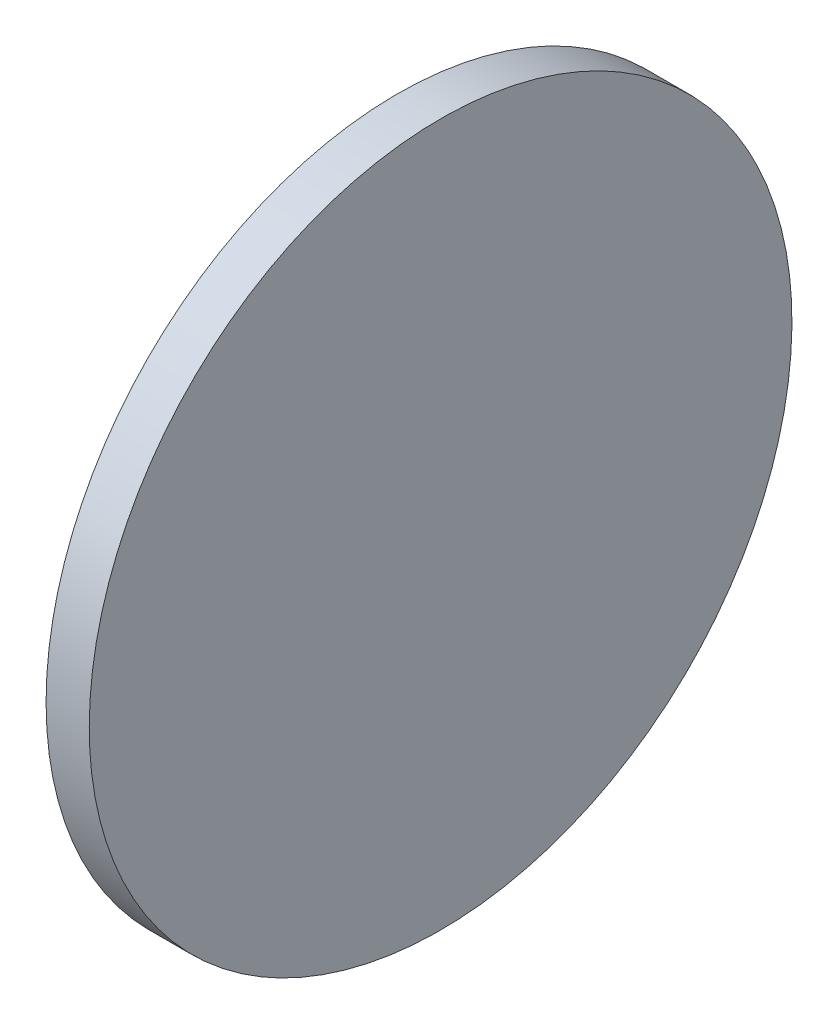
ISO-10303-21;
HEADER;
FILE_DESCRIPTION(('STEP AP214'),'2;1');
FILE_NAME('part.step','',(''),(''),'','','');
FILE_SCHEMA(('AUTOMOTIVE_DESIGN { 1 0 10303 214 1 1 1 1 }'));
ENDSEC;
DATA;
#1=APPLICATION_CONTEXT('core data for automotive mechanical design processes');
#2=APPLICATION_PROTOCOL_DEFINITION('international standard','automotive_design',2000,#1);
#3=PRODUCT_CONTEXT('',#1,'mechanical');
#4=PRODUCT('Part','Part','',(#3));
#5=PRODUCT_RELATED_PRODUCT_CATEGORY('part','',(#4));
#6=PRODUCT_DEFINITION_FORMATION('','',#4);
#7=PRODUCT_DEFINITION_CONTEXT('part definition',#1,'design');
#8=PRODUCT_DEFINITION('design','',#6,#7);
#9=PRODUCT_DEFINITION_SHAPE('','',#8);
#10=(LENGTH_UNIT() NAMED_UNIT(*) SI_UNIT(.MILLI.,.METRE.));
#11=(NAMED_UNIT(*) PLANE_ANGLE_UNIT() SI_UNIT($,.RADIAN.));
#12=(NAMED_UNIT(*) SI_UNIT($,.STERADIAN.) SOLID_ANGLE_UNIT());
#13=UNCERTAINTY_MEASURE_WITH_UNIT(LENGTH_MEASURE(1.E-05),#10,'distance_accuracy_value','');
#14=(GEOMETRIC_REPRESENTATION_CONTEXT(3) GLOBAL_UNCERTAINTY_ASSIGNED_CONTEXT((#13)) GLOBAL_UNIT_ASSIGNED_CONTEXT((#10,
#11,#12)) REPRESENTATION_CONTEXT('',''));
#15=CARTESIAN_POINT('',(0.,0.,0.));
#16=DIRECTION('',(0.,0.,1.));
#17=DIRECTION('',(1.,0.,0.));
#18=AXIS2_PLACEMENT_3D('',#15,#16,#17);
#19=CARTESIAN_POINT('',(-77.2375678722767,-9.28326390853357,-8.01565750597513));
#20=CARTESIAN_POINT('',(-77.2375678722767,-8.80421803646308,-8.01565750597513));
#21=CARTESIAN_POINT('',(-77.2375678722767,-7.8461262923221,-8.11002130640049));
#22=CARTESIAN_POINT('',(-77.2375678722767,-6.46421706874558,-8.52921888641883));
#23=CARTESIAN_POINT('',(-77.2375678722767,-5.19064223428243,-9.20995881790606));
#24=CARTESIAN_POINT('',(-77.2375678722767,-4.07434455559207,-10.1260806470585));
#25=CARTESIAN_POINT('',(-77.2375678722767,-3.15822272643963,-11.2423783257489));
#26=CARTESIAN_POINT('',(-77.2375678722767,-2.47748279495239,-12.515953160212));
#27=CARTESIAN_POINT('',(-77.2375678722767,-2.05828521493405,-13.8978623837885));
#28=CARTESIAN_POINT('',(-77.2375678722767,-1.91673951429602,-15.335));
#29=CARTESIAN_POINT('',(-77.2375678722767,-2.05828521493405,-16.7721376162115));
#30=CARTESIAN_POINT('',(-77.2375678722767,-2.47748279495239,-18.154046839788));
#31=CARTESIAN_POINT('',(-77.2375678722767,-3.15822272643963,-19.4276216742511));
#32=CARTESIAN_POINT('',(-77.2375678722767,-4.07434455559207,-20.5439193529415));
#33=CARTESIAN_POINT('',(-77.2375678722767,-5.19064223428243,-21.4600411820939));
#34=CARTESIAN_POINT('',(-77.2375678722767,-6.46421706874558,-22.1407811135812));
#35=CARTESIAN_POINT('',(-77.2375678722767,-7.8461262923221,-22.5599786935995));
#36=CARTESIAN_POINT('',(-77.2375678722767,-9.28326390853357,-22.7015243942376));
#37=CARTESIAN_POINT('',(-77.2375678722767,-10.720401524745,-22.5599786935995));
#38=CARTESIAN_POINT('',(-77.2375678722767,-12.1023107483216,-22.1407811135812));
#39=CARTESIAN_POINT('',(-77.2375678722767,-13.3758855827847,-21.4600411820939));
#40=CARTESIAN_POINT('',(-77.2375678722767,-14.4921832614751,-20.5439193529415));
#41=CARTESIAN_POINT('',(-77.2375678722767,-15.4083050906275,-19.4276216742511));
#42=CARTESIAN_POINT('',(-77.2375678722767,-16.0890450221147,-18.154046839788));
#43=CARTESIAN_POINT('',(-77.2375678722767,-16.5082426021331,-16.7721376162115));
#44=CARTESIAN_POINT('',(-77.2375678722767,-16.6497883027711,-15.335));
#45=CARTESIAN_POINT('',(-77.2375678722767,-16.5082426021331,-13.8978623837885));
#46=CARTESIAN_POINT('',(-77.2375678722767,-16.0890450221147,-12.515953160212));
#47=CARTESIAN_POINT('',(-77.2375678722767,-15.4083050906275,-11.2423783257489));
#48=CARTESIAN_POINT('',(-77.2375678722767,-14.4921832614751,-10.1260806470585));
#49=CARTESIAN_POINT('',(-77.2375678722767,-13.3758855827847,-9.20995881790606));
#50=CARTESIAN_POINT('',(-77.2375678722767,-12.1023107483216,-8.52921888641882));
#51=CARTESIAN_POINT('',(-77.2375678722767,-10.720401524745,-8.11002130640049));
#52=CARTESIAN_POINT('',(-77.2375678722767,-9.76230978060406,-8.01565750597513));
#53=CARTESIAN_POINT('',(-77.2375678722767,-9.28326390853357,-8.01565750597513));
#54=B_SPLINE_CURVE_WITH_KNOTS('',3,(#19,#20,#21,#22,#23,#24,#25,#26,#27,#28,#29,#30,#31,#32,#33,
#34,#35,#36,#37,#38,#39,#40,#41,#42,#43,#44,#45,#46,#47,#48,#49,#50,#51,#52,#53),.UNSPECIFIED.,
.T.,.F.,(4,1,1,1,1,1,1,1,1,1,1,1,1,1,1,1,1,1,1,1,1,1,1,1,1,1,1,1,1,1,1,1,4),(0.,0.03125,0.0625,
0.09375,0.125,0.15625,0.1875,0.21875,0.25,0.28125,0.3125,0.34375,0.375,0.40625,0.4375,0.46875,
0.5,0.53125,0.5625,0.59375,0.625,0.65625,0.6875,0.71875,0.75,0.78125,0.8125,0.84375,0.875,
0.90625,0.9375,0.96875,1.),.UNSPECIFIED.);
#55=DIRECTION('',(-1.,0.,0.));
#56=VECTOR('',#55,1.);
#57=SURFACE_OF_LINEAR_EXTRUSION('',#54,#56);
#58=CARTESIAN_POINT('',(-77.2375678722767,-9.28326390853357,-8.01565750597513));
#59=CARTESIAN_POINT('',(-77.2375678722767,-8.80421803646308,-8.01565750597513));
#60=CARTESIAN_POINT('',(-77.2375678722767,-7.8461262923221,-8.11002130640049));
#61=CARTESIAN_POINT('',(-77.2375678722767,-6.46421706874558,-8.52921888641883));
#62=CARTESIAN_POINT('',(-77.2375678722767,-5.19064223428243,-9.20995881790606));
#63=CARTESIAN_POINT('',(-77.2375678722767,-4.07434455559207,-10.1260806470585));
#64=CARTESIAN_POINT('',(-77.2375678722767,-3.15822272643963,-11.2423783257489));
#65=CARTESIAN_POINT('',(-77.2375678722767,-2.47748279495239,-12.515953160212));
#66=CARTESIAN_POINT('',(-77.2375678722767,-2.05828521493405,-13.8978623837885));
#67=CARTESIAN_POINT('',(-77.2375678722767,-1.91673951429602,-15.335));
#68=CARTESIAN_POINT('',(-77.2375678722767,-2.05828521493405,-16.7721376162115));
#69=CARTESIAN_POINT('',(-77.2375678722767,-2.47748279495239,-18.154046839788));
#70=CARTESIAN_POINT('',(-77.2375678722767,-3.15822272643963,-19.4276216742511));
#71=CARTESIAN_POINT('',(-77.2375678722767,-4.07434455559207,-20.5439193529415));
#72=CARTESIAN_POINT('',(-77.2375678722767,-5.19064223428243,-21.4600411820939));
#73=CARTESIAN_POINT('',(-77.2375678722767,-6.46421706874558,-22.1407811135812));
#74=CARTESIAN_POINT('',(-77.2375678722767,-7.8461262923221,-22.5599786935995));
#75=CARTESIAN_POINT('',(-77.2375678722767,-9.28326390853357,-22.7015243942376));
#76=CARTESIAN_POINT('',(-77.2375678722767,-10.720401524745,-22.5599786935995));
#77=CARTESIAN_POINT('',(-77.2375678722767,-12.1023107483216,-22.1407811135812));
#78=CARTESIAN_POINT('',(-77.2375678722767,-13.3758855827847,-21.4600411820939));
#79=CARTESIAN_POINT('',(-77.2375678722767,-14.4921832614751,-20.5439193529415));
#80=CARTESIAN_POINT('',(-77.2375678722767,-15.4083050906275,-19.4276216742511));
#81=CARTESIAN_POINT('',(-77.2375678722767,-16.0890450221147,-18.154046839788));
#82=CARTESIAN_POINT('',(-77.2375678722767,-16.5082426021331,-16.7721376162115));
#83=CARTESIAN_POINT('',(-77.2375678722767,-16.6497883027711,-15.335));
#84=CARTESIAN_POINT('',(-77.2375678722767,-16.5082426021331,-13.8978623837885));
#85=CARTESIAN_POINT('',(-77.2375678722767,-16.0890450221147,-12.515953160212));
#86=CARTESIAN_POINT('',(-77.2375678722767,-15.4083050906275,-11.2423783257489));
#87=CARTESIAN_POINT('',(-77.2375678722767,-14.4921832614751,-10.1260806470585));
#88=CARTESIAN_POINT('',(-77.2375678722767,-13.3758855827847,-9.20995881790606));
#89=CARTESIAN_POINT('',(-77.2375678722767,-12.1023107483216,-8.52921888641882));
#90=CARTESIAN_POINT('',(-77.2375678722767,-10.720401524745,-8.11002130640049));
#91=CARTESIAN_POINT('',(-77.2375678722767,-9.76230978060406,-8.01565750597513));
#92=CARTESIAN_POINT('',(-77.2375678722767,-9.28326390853357,-8.01565750597513));
#93=B_SPLINE_CURVE_WITH_KNOTS('',3,(#58,#59,#60,#61,#62,#63,#64,#65,#66,#67,#68,#69,#70,#71,#72,
#73,#74,#75,#76,#77,#78,#79,#80,#81,#82,#83,#84,#85,#86,#87,#88,#89,#90,#91,#92),.UNSPECIFIED.,
.T.,.F.,(4,1,1,1,1,1,1,1,1,1,1,1,1,1,1,1,1,1,1,1,1,1,1,1,1,1,1,1,1,1,1,1,4),(0.,0.03125,0.0625,
0.09375,0.125,0.15625,0.1875,0.21875,0.25,0.28125,0.3125,0.34375,0.375,0.40625,0.4375,0.46875,
0.5,0.53125,0.5625,0.59375,0.625,0.65625,0.6875,0.71875,0.75,0.78125,0.8125,0.84375,0.875,
0.90625,0.9375,0.96875,1.),.UNSPECIFIED.);
#94=CARTESIAN_POINT('',(-77.2375678722767,-9.28326390853357,-8.01565750597513));
#95=VERTEX_POINT('',#94);
#96=EDGE_CURVE('E10',#95,#95,#93,.T.);
#97=ORIENTED_EDGE('',*,*,#96,.T.);
#98=EDGE_LOOP('',(#97));
#99=FACE_BOUND('',#98,.T.);
#100=CARTESIAN_POINT('',(-78.1368546740449,-9.28326390853357,-8.01565750597513));
#101=CARTESIAN_POINT('',(-78.1368546740449,-9.40302611192993,-8.01565753081639));
#102=CARTESIAN_POINT('',(-78.1368546740449,-9.52278744371222,-8.01860640995524));
#103=CARTESIAN_POINT('',(-78.1368546740449,-9.76202246275414,-8.03037352943423));
#104=CARTESIAN_POINT('',(-78.1368546740449,-9.88149614777216,-8.03919181536673));
#105=CARTESIAN_POINT('',(-78.1368546740449,-10.11986810248,-8.0626694001569));
#106=CARTESIAN_POINT('',(-78.1368546740449,-10.2387663721698,-8.07732869901456));
#107=CARTESIAN_POINT('',(-78.1368546740449,-10.4757004562651,-8.11246015693882));
#108=CARTESIAN_POINT('',(-78.1368546740449,-10.5937362773629,-8.13293227085123));
#109=CARTESIAN_POINT('',(-78.1368546740449,-10.8286573079155,-8.17966096840985));
#110=CARTESIAN_POINT('',(-78.1368546740449,-10.9455425173703,-8.20591755205606));
#111=CARTESIAN_POINT('',(-78.1368546740449,-11.1778853119867,-8.26413107213635));
#112=CARTESIAN_POINT('',(-78.1368546740449,-11.2933428860515,-8.29608805284855));
#113=CARTESIAN_POINT('',(-78.1368546740449,-11.5225542711089,-8.36561856625616));
#114=CARTESIAN_POINT('',(-78.1368546740449,-11.6363080821015,-8.40319209895157));
#115=CARTESIAN_POINT('',(-78.1368546740449,-11.8618357554725,-8.48387206723541));
#116=CARTESIAN_POINT('',(-78.1368546740449,-11.973609633224,-8.52697845984292));
#117=CARTESIAN_POINT('',(-78.1368546740449,-12.1949004003814,-8.6186400968177));
#118=CARTESIAN_POINT('',(-78.1368546740449,-12.3044172897873,-8.66719534118496));
#119=CARTESIAN_POINT('',(-78.1368546740449,-12.5209387897195,-8.76961813575815));
#120=CARTESIAN_POINT('',(-78.1368546740449,-12.627943380724,-8.82348572722654));
#121=CARTESIAN_POINT('',(-78.1368546740449,-12.8391858026787,-8.93639715414561));
#122=CARTESIAN_POINT('',(-78.1368546740449,-12.9434236336289,-8.9954409895963));
#123=CARTESIAN_POINT('',(-78.1368546740449,-13.1488779750984,-9.11856898135826));
#124=CARTESIAN_POINT('',(-78.1368546740449,-13.2500945090806,-9.18265309851363));
#125=CARTESIAN_POINT('',(-78.1368546740449,-13.4492509378979,-9.31572516985358));
#126=CARTESIAN_POINT('',(-78.1368546740449,-13.5471908327331,-9.38471312403816));
#127=CARTESIAN_POINT('',(-78.1368546740449,-13.7395702367892,-9.52740914248023));
#128=CARTESIAN_POINT('',(-78.1368546740449,-13.8340097188137,-9.60111724339884));
#129=CARTESIAN_POINT('',(-78.1368546740449,-14.0191652502248,-9.75307046103254));
#130=CARTESIAN_POINT('',(-78.1368546740449,-14.1098812996114,-9.83131557774763));
#131=CARTESIAN_POINT('',(-78.1368546740449,-14.2873668139582,-9.9921598533104));
#132=CARTESIAN_POINT('',(-78.1368546740449,-14.3741363095692,-10.0747589783319));
#133=CARTESIAN_POINT('',(-78.1368546740449,-14.5435049302017,-10.2441275989644));
#134=CARTESIAN_POINT('',(-78.1368546740449,-14.6261040552232,-10.3308970945754));
#135=CARTESIAN_POINT('',(-78.1368546740449,-14.786948330786,-10.5083826089222));
#136=CARTESIAN_POINT('',(-78.1368546740449,-14.8651934475011,-10.5990986583088));
#137=CARTESIAN_POINT('',(-78.1368546740449,-15.0171466651347,-10.7842541897199));
#138=CARTESIAN_POINT('',(-78.1368546740449,-15.0908547660534,-10.8786936717443));
#139=CARTESIAN_POINT('',(-78.1368546740449,-15.2335507844954,-11.0710730758005));
#140=CARTESIAN_POINT('',(-78.1368546740449,-15.30253873868,-11.1690129706357));
#141=CARTESIAN_POINT('',(-78.1368546740449,-15.43561081002,-11.3681693994529));
#142=CARTESIAN_POINT('',(-78.1368546740449,-15.4996949271753,-11.4693859334349));
#143=CARTESIAN_POINT('',(-78.1368546740449,-15.6228229189373,-11.674840274905));
#144=CARTESIAN_POINT('',(-78.1368546740449,-15.681866754388,-11.7790781058559));
#145=CARTESIAN_POINT('',(-78.1368546740449,-15.794778181307,-11.9903205278086));
#146=CARTESIAN_POINT('',(-78.1368546740449,-15.8486457727753,-12.0973251188105));
#147=CARTESIAN_POINT('',(-78.1368546740449,-15.9510685673488,-12.3138466187499));
#148=CARTESIAN_POINT('',(-78.1368546740449,-15.9996238117165,-12.4233635081656));
#149=CARTESIAN_POINT('',(-78.1368546740449,-16.09128544869,-12.6446542752962));
#150=CARTESIAN_POINT('',(-78.1368546740449,-16.1343918412957,-12.7564281530112));
#151=CARTESIAN_POINT('',(-78.1368546740449,-16.2150718095845,-12.981955826482));
#152=CARTESIAN_POINT('',(-78.1368546740449,-16.2526453422866,-13.0957096376109));
#153=CARTESIAN_POINT('',(-78.1368546740449,-16.3221758556758,-13.3249210222958));
#154=CARTESIAN_POINT('',(-78.1368546740449,-16.3541328363629,-13.4403785958519));
#155=CARTESIAN_POINT('',(-78.1368546740449,-16.4123463565118,-13.6727213918583));
#156=CARTESIAN_POINT('',(-78.1368546740449,-16.4386029402518,-13.7896066032121));
#157=CARTESIAN_POINT('',(-78.1368546740449,-16.4853316375543,-14.0245276285766));
#158=CARTESIAN_POINT('',(-78.1368546740449,-16.5058037511169,-14.1425634425874));
#159=CARTESIAN_POINT('',(-78.1368546740449,-16.5409352099969,-14.3794975460449));
#160=CARTESIAN_POINT('',(-78.1368546740449,-16.5555945101602,-14.4983958421841));
#161=CARTESIAN_POINT('',(-78.1368546740449,-16.5790720913833,-14.736767724631));
#162=CARTESIAN_POINT('',(-78.1368546740449,-16.5878903724431,-14.8562413109387));
#163=CARTESIAN_POINT('',(-78.1368546740449,-16.5996575052346,-15.0954765996611));
#164=CARTESIAN_POINT('',(-78.1368546740449,-16.6026064025584,-15.2152382998306));
#165=CARTESIAN_POINT('',(-78.1368546740449,-16.6026064025584,-15.4547617001695));
#166=CARTESIAN_POINT('',(-78.1368546740449,-16.5996575052346,-15.5745234003389));
#167=CARTESIAN_POINT('',(-78.1368546740449,-16.5878903724431,-15.8137586890614));
#168=CARTESIAN_POINT('',(-78.1368546740449,-16.5790720913833,-15.9332322753691));
#169=CARTESIAN_POINT('',(-78.1368546740449,-16.5555945101602,-16.171604157816));
#170=CARTESIAN_POINT('',(-78.1368546740449,-16.5409352099969,-16.2905024539551));
#171=CARTESIAN_POINT('',(-78.1368546740449,-16.5058037511169,-16.5274365574126));
#172=CARTESIAN_POINT('',(-78.1368546740449,-16.4853316375543,-16.6454723714234));
#173=CARTESIAN_POINT('',(-78.1368546740449,-16.4386029402518,-16.8803933967879));
#174=CARTESIAN_POINT('',(-78.1368546740449,-16.4123463565118,-16.9972786081417));
#175=CARTESIAN_POINT('',(-78.1368546740449,-16.3541328363629,-17.2296214041482));
#176=CARTESIAN_POINT('',(-78.1368546740449,-16.3221758556758,-17.3450789777042));
#177=CARTESIAN_POINT('',(-78.1368546740449,-16.2526453422866,-17.5742903623891));
#178=CARTESIAN_POINT('',(-78.1368546740449,-16.2150718095845,-17.6880441735181));
#179=CARTESIAN_POINT('',(-78.1368546740449,-16.1343918412957,-17.9135718469889));
#180=CARTESIAN_POINT('',(-78.1368546740449,-16.09128544869,-18.0253457247038));
#181=CARTESIAN_POINT('',(-78.1368546740449,-15.9996238117165,-18.2466364918344));
#182=CARTESIAN_POINT('',(-78.1368546740449,-15.9510685673488,-18.3561533812502));
#183=CARTESIAN_POINT('',(-78.1368546740449,-15.8486457727752,-18.5726748811895));
#184=CARTESIAN_POINT('',(-78.1368546740449,-15.794778181307,-18.6796794721914));
#185=CARTESIAN_POINT('',(-78.1368546740449,-15.681866754388,-18.8909218941442));
#186=CARTESIAN_POINT('',(-78.1368546740449,-15.6228229189373,-18.9951597250951));
#187=CARTESIAN_POINT('',(-78.1368546740449,-15.4996949271753,-19.2006140665651));
#188=CARTESIAN_POINT('',(-78.1368546740449,-15.4356108100199,-19.3018306005471));
#189=CARTESIAN_POINT('',(-78.1368546740449,-15.30253873868,-19.5009870293643));
#190=CARTESIAN_POINT('',(-78.1368546740449,-15.2335507844954,-19.5989269241995));
#191=CARTESIAN_POINT('',(-78.1368546740449,-15.0908547660533,-19.7913063282557));
#192=CARTESIAN_POINT('',(-78.1368546740449,-15.0171466651347,-19.8857458102801));
#193=CARTESIAN_POINT('',(-78.1368546740449,-14.865193447501,-20.0709013416912));
#194=CARTESIAN_POINT('',(-78.1368546740449,-14.7869483307859,-20.1616173910779));
#195=CARTESIAN_POINT('',(-78.1368546740449,-14.6261040552232,-20.3391029054246));
#196=CARTESIAN_POINT('',(-78.1368546740449,-14.5435049302017,-20.4258724010356));
#197=CARTESIAN_POINT('',(-78.1368546740449,-14.3741363095691,-20.5952410216681));
#198=CARTESIAN_POINT('',(-78.1368546740449,-14.2873668139581,-20.6778401466896));
#199=CARTESIAN_POINT('',(-78.1368546740449,-14.1098812996114,-20.8386844222524));
#200=CARTESIAN_POINT('',(-78.1368546740449,-14.0191652502248,-20.9169295389675));
#201=CARTESIAN_POINT('',(-78.1368546740449,-13.8340097188137,-21.0688827566012));
#202=CARTESIAN_POINT('',(-78.1368546740449,-13.7395702367892,-21.1425908575198));
#203=CARTESIAN_POINT('',(-78.1368546740449,-13.547190832733,-21.2852868759619));
#204=CARTESIAN_POINT('',(-78.1368546740449,-13.4492509378978,-21.3542748301464));
#205=CARTESIAN_POINT('',(-78.1368546740449,-13.2500945090806,-21.4873469014864));
#206=CARTESIAN_POINT('',(-78.1368546740449,-13.1488779750987,-21.5514310186418));
#207=CARTESIAN_POINT('',(-78.1368546740449,-12.9434236336286,-21.6745590104037));
#208=CARTESIAN_POINT('',(-78.1368546740449,-12.8391858026777,-21.7336028458545));
#209=CARTESIAN_POINT('',(-78.1368546740449,-12.6279433807249,-21.8465142727734));
#210=CARTESIAN_POINT('',(-78.1368546740449,-12.520938789723,-21.9003818642417));
#211=CARTESIAN_POINT('',(-78.1368546740449,-12.3044172897837,-22.0028046588152));
#212=CARTESIAN_POINT('',(-78.1368546740449,-12.194900400368,-22.051359903183));
#213=CARTESIAN_POINT('',(-78.1368546740449,-11.9736096332373,-22.1430215401564));
#214=CARTESIAN_POINT('',(-78.1368546740449,-11.8618357555224,-22.1861279327621));
#215=CARTESIAN_POINT('',(-78.1368546740449,-11.6363080820516,-22.2668079010509));
#216=CARTESIAN_POINT('',(-78.1368546740449,-11.5225542709227,-22.3043814337531));
#217=CARTESIAN_POINT('',(-78.1368546740449,-11.2933428862377,-22.3739119471423));
#218=CARTESIAN_POINT('',(-78.1368546740449,-11.1778853126817,-22.4058689278293));
#219=CARTESIAN_POINT('',(-78.1368546740449,-10.9455425166752,-22.4640824479783));
#220=CARTESIAN_POINT('',(-78.1368546740449,-10.8286573053215,-22.4903390317182));
#221=CARTESIAN_POINT('',(-78.1368546740449,-10.5937362799569,-22.5370677290207));
#222=CARTESIAN_POINT('',(-78.1368546740449,-10.4757004659461,-22.5575398425833));
#223=CARTESIAN_POINT('',(-78.1368546740449,-10.2387663624887,-22.5926713014633));
#224=CARTESIAN_POINT('',(-78.1368546740449,-10.1198680663495,-22.6073306016267));
#225=CARTESIAN_POINT('',(-78.1368546740449,-9.88149618390262,-22.6308081828497));
#226=CARTESIAN_POINT('',(-78.1368546740449,-9.76202259759491,-22.6396264639095));
#227=CARTESIAN_POINT('',(-78.1368546740449,-9.52278730887248,-22.651393596701));
#228=CARTESIAN_POINT('',(-78.1368546740449,-9.40302560870302,-22.6543424940249));
#229=CARTESIAN_POINT('',(-78.1368546740449,-9.16350220836409,-22.6543424940249));
#230=CARTESIAN_POINT('',(-78.1368546740449,-9.04374050819463,-22.651393596701));
#231=CARTESIAN_POINT('',(-78.1368546740449,-8.80450521947221,-22.6396264639095));
#232=CARTESIAN_POINT('',(-78.1368546740449,-8.68503163316449,-22.6308081828497));
#233=CARTESIAN_POINT('',(-78.1368546740449,-8.44665975071761,-22.6073306016267));
#234=CARTESIAN_POINT('',(-78.1368546740449,-8.32776145457844,-22.5926713014633));
#235=CARTESIAN_POINT('',(-78.1368546740449,-8.09082735112097,-22.5575398425833));
#236=CARTESIAN_POINT('',(-78.1368546740449,-7.97279153711019,-22.5370677290207));
#237=CARTESIAN_POINT('',(-78.1368546740449,-7.73787051174564,-22.4903390317182));
#238=CARTESIAN_POINT('',(-78.1368546740449,-7.62098530039187,-22.4640824479783));
#239=CARTESIAN_POINT('',(-78.1368546740449,-7.3886425043854,-22.4058689278293));
#240=CARTESIAN_POINT('',(-78.1368546740449,-7.27318493082939,-22.3739119471423));
#241=CARTESIAN_POINT('',(-78.1368546740449,-7.04397354614445,-22.304381433753));
#242=CARTESIAN_POINT('',(-78.1368546740449,-6.93021973501552,-22.2668079010509));
#243=CARTESIAN_POINT('',(-78.1368546740449,-6.7046920615447,-22.1861279327621));
#244=CARTESIAN_POINT('',(-78.1368546740449,-6.59291818382978,-22.1430215401564));
#245=CARTESIAN_POINT('',(-78.1368546740449,-6.37162741669914,-22.051359903183));
#246=CARTESIAN_POINT('',(-78.1368546740449,-6.26211052728342,-22.0028046588152));
#247=CARTESIAN_POINT('',(-78.1368546740449,-6.04558902734409,-21.9003818642417));
#248=CARTESIAN_POINT('',(-78.1368546740449,-5.93858443634218,-21.8465142727734));
#249=CARTESIAN_POINT('',(-78.1368546740449,-5.7273420143894,-21.7336028458544));
#250=CARTESIAN_POINT('',(-78.1368546740449,-5.62310418343852,-21.6745590104037));
#251=CARTESIAN_POINT('',(-78.1368546740449,-5.41764984196846,-21.5514310186417));
#252=CARTESIAN_POINT('',(-78.1368546740449,-5.31643330798648,-21.4873469014864));
#253=CARTESIAN_POINT('',(-78.1368546740449,-5.11727687916929,-21.3542748301464));
#254=CARTESIAN_POINT('',(-78.1368546740449,-5.01933698433407,-21.2852868759618));
#255=CARTESIAN_POINT('',(-78.1368546740449,-4.82695758027789,-21.1425908575198));
#256=CARTESIAN_POINT('',(-78.1368546740449,-4.73251809825343,-21.0688827566012));
#257=CARTESIAN_POINT('',(-78.1368546740449,-4.54736256684234,-20.9169295389675));
#258=CARTESIAN_POINT('',(-78.1368546740449,-4.4566465174557,-20.8386844222524));
#259=CARTESIAN_POINT('',(-78.1368546740449,-4.27916100310897,-20.6778401466896));
#260=CARTESIAN_POINT('',(-78.1368546740449,-4.19239150749797,-20.5952410216681));
#261=CARTESIAN_POINT('',(-78.1368546740449,-4.02302288686546,-20.4258724010356));
#262=CARTESIAN_POINT('',(-78.1368546740449,-3.94042376184395,-20.3391029054246));
#263=CARTESIAN_POINT('',(-78.1368546740449,-3.77957948628118,-20.1616173910779));
#264=CARTESIAN_POINT('',(-78.1368546740449,-3.70133436956609,-20.0709013416912));
#265=CARTESIAN_POINT('',(-78.1368546740449,-3.5493811519324,-19.8857458102801));
#266=CARTESIAN_POINT('',(-78.1368546740449,-3.47567305101379,-19.7913063282557));
#267=CARTESIAN_POINT('',(-78.1368546740449,-3.33297703257172,-19.5989269241995));
#268=CARTESIAN_POINT('',(-78.1368546740449,-3.26398907838713,-19.5009870293643));
#269=CARTESIAN_POINT('',(-78.1368546740449,-3.13091700704719,-19.3018306005471));
#270=CARTESIAN_POINT('',(-78.1368546740449,-3.06683288989183,-19.2006140665651));
#271=CARTESIAN_POINT('',(-78.1368546740449,-2.94370489812984,-18.995159725095));
#272=CARTESIAN_POINT('',(-78.1368546740449,-2.88466106267912,-18.8909218941442));
#273=CARTESIAN_POINT('',(-78.1368546740449,-2.77174963576014,-18.6796794721914));
#274=CARTESIAN_POINT('',(-78.1368546740449,-2.71788204429188,-18.5726748811895));
#275=CARTESIAN_POINT('',(-78.1368546740449,-2.61545924971835,-18.3561533812501));
#276=CARTESIAN_POINT('',(-78.1368546740449,-2.5669040053506,-18.2466364918344));
#277=CARTESIAN_POINT('',(-78.1368546740449,-2.47524236837714,-18.0253457247038));
#278=CARTESIAN_POINT('',(-78.1368546740449,-2.43213597577143,-17.9135718469889));
#279=CARTESIAN_POINT('',(-78.1368546740449,-2.35145600748267,-17.688044173518));
#280=CARTESIAN_POINT('',(-78.1368546740449,-2.31388247478052,-17.5742903623891));
#281=CARTESIAN_POINT('',(-78.1368546740449,-2.2443519613913,-17.3450789777042));
#282=CARTESIAN_POINT('',(-78.1368546740449,-2.21239498070422,-17.2296214041482));
#283=CARTESIAN_POINT('',(-78.1368546740449,-2.15418146055531,-16.9972786081417));
#284=CARTESIAN_POINT('',(-78.1368546740449,-2.12792487681536,-16.8803933967879));
#285=CARTESIAN_POINT('',(-78.1368546740449,-2.08119617951284,-16.6454723714234));
#286=CARTESIAN_POINT('',(-78.1368546740449,-2.06072406595027,-16.5274365574126));
#287=CARTESIAN_POINT('',(-78.1368546740449,-2.02559260707023,-16.2905024539551));
#288=CARTESIAN_POINT('',(-78.1368546740449,-2.01093330690692,-16.1716041578159));
#289=CARTESIAN_POINT('',(-78.1368546740449,-1.98745572568383,-15.9332322753691));
#290=CARTESIAN_POINT('',(-78.1368546740449,-1.97863744462406,-15.8137586890613));
#291=CARTESIAN_POINT('',(-78.1368546740449,-1.96687031183258,-15.5745234003389));
#292=CARTESIAN_POINT('',(-78.1368546740449,-1.9639214145087,-15.4547617001695));
#293=CARTESIAN_POINT('',(-78.1368546740449,-1.9639214145087,-15.2152382998305));
#294=CARTESIAN_POINT('',(-78.1368546740449,-1.96687031183258,-15.0954765996611));
#295=CARTESIAN_POINT('',(-78.1368546740449,-1.97863744462406,-14.8562413109387));
#296=CARTESIAN_POINT('',(-78.1368546740449,-1.98745572568383,-14.7367677246309));
#297=CARTESIAN_POINT('',(-78.1368546740449,-2.01093330690692,-14.4983958421841));
#298=CARTESIAN_POINT('',(-78.1368546740449,-2.02559260707023,-14.3794975460449));
#299=CARTESIAN_POINT('',(-78.1368546740449,-2.06072406595027,-14.1425634425874));
#300=CARTESIAN_POINT('',(-78.1368546740449,-2.08119617951284,-14.0245276285766));
#301=CARTESIAN_POINT('',(-78.1368546740449,-2.12792487681536,-13.7896066032121));
#302=CARTESIAN_POINT('',(-78.1368546740449,-2.15418146055531,-13.6727213918583));
#303=CARTESIAN_POINT('',(-78.1368546740449,-2.21239498070422,-13.4403785958518));
#304=CARTESIAN_POINT('',(-78.1368546740449,-2.2443519613913,-13.3249210222958));
#305=CARTESIAN_POINT('',(-78.1368546740449,-2.31388247478053,-13.0957096376109));
#306=CARTESIAN_POINT('',(-78.1368546740449,-2.35145600748267,-12.981955826482));
#307=CARTESIAN_POINT('',(-78.1368546740449,-2.43213597577143,-12.7564281530111));
#308=CARTESIAN_POINT('',(-78.1368546740449,-2.47524236837715,-12.6446542752962));
#309=CARTESIAN_POINT('',(-78.1368546740449,-2.5669040053506,-12.4233635081656));
#310=CARTESIAN_POINT('',(-78.1368546740449,-2.61545924971835,-12.3138466187499));
#311=CARTESIAN_POINT('',(-78.136854674045,-2.71788204429189,-12.0973251188105));
#312=CARTESIAN_POINT('',(-78.136854674045,-2.77174963576015,-11.9903205278086));
#313=CARTESIAN_POINT('',(-78.1368546740449,-2.88466106267913,-11.7790781058558));
#314=CARTESIAN_POINT('',(-78.1368546740449,-2.94370489812985,-11.674840274905));
#315=CARTESIAN_POINT('',(-78.1368546740449,-3.06683288989183,-11.4693859334349));
#316=CARTESIAN_POINT('',(-78.1368546740449,-3.13091700704719,-11.3681693994529));
#317=CARTESIAN_POINT('',(-78.1368546740449,-3.26398907838714,-11.1690129706357));
#318=CARTESIAN_POINT('',(-78.1368546740449,-3.33297703257172,-11.0710730758005));
#319=CARTESIAN_POINT('',(-78.1368546740449,-3.47567305101379,-10.8786936717443));
#320=CARTESIAN_POINT('',(-78.1368546740449,-3.5493811519324,-10.7842541897199));
#321=CARTESIAN_POINT('',(-78.1368546740449,-3.7013343695661,-10.5990986583088));
#322=CARTESIAN_POINT('',(-78.1368546740449,-3.77957948628118,-10.5083826089221));
#323=CARTESIAN_POINT('',(-78.1368546740449,-3.94042376184395,-10.3308970945754));
#324=CARTESIAN_POINT('',(-78.1368546740449,-4.02302288686547,-10.2441275989644));
#325=CARTESIAN_POINT('',(-78.1368546740449,-4.19239150749798,-10.0747589783319));
#326=CARTESIAN_POINT('',(-78.1368546740449,-4.27916100310898,-9.99215985331039));
#327=CARTESIAN_POINT('',(-78.1368546740449,-4.45664651745571,-9.83131557774762));
#328=CARTESIAN_POINT('',(-78.1368546740449,-4.54736256684234,-9.75307046103253));
#329=CARTESIAN_POINT('',(-78.1368546740449,-4.73251809825344,-9.60111724339884));
#330=CARTESIAN_POINT('',(-78.1368546740449,-4.82695758027792,-9.52740914248023));
#331=CARTESIAN_POINT('',(-78.1368546740449,-5.01933698433406,-9.38471312403816));
#332=CARTESIAN_POINT('',(-78.1368546740449,-5.11727687916923,-9.31572516985357));
#333=CARTESIAN_POINT('',(-78.1368546740449,-5.31643330798656,-9.18265309851362));
#334=CARTESIAN_POINT('',(-78.1368546740449,-5.41764984196873,-9.11856898135825));
#335=CARTESIAN_POINT('',(-78.1368546740449,-5.62310418343827,-8.9954409895963));
#336=CARTESIAN_POINT('',(-78.1368546740449,-5.72734201438845,-8.93639715414561));
#337=CARTESIAN_POINT('',(-78.1368546740449,-5.93858443634315,-8.82348572722654));
#338=CARTESIAN_POINT('',(-78.1368546740449,-6.04558902734768,-8.76961813575815));
#339=CARTESIAN_POINT('',(-78.1368546740449,-6.26211052727985,-8.66719534118496));
#340=CARTESIAN_POINT('',(-78.1368546740449,-6.37162741668578,-8.6186400968177));
#341=CARTESIAN_POINT('',(-78.1368546740449,-6.59291818384317,-8.52697845984292));
#342=CARTESIAN_POINT('',(-78.1368546740449,-6.70469206159462,-8.48387206723541));
#343=CARTESIAN_POINT('',(-78.1368546740449,-6.93021973496562,-8.40319209895157));
#344=CARTESIAN_POINT('',(-78.1368546740449,-7.04397354595821,-8.36561856625616));
#345=CARTESIAN_POINT('',(-78.1368546740449,-7.27318493101565,-8.29608805284854));
#346=CARTESIAN_POINT('',(-78.1368546740449,-7.38864250508049,-8.26413107213635));
#347=CARTESIAN_POINT('',(-78.1368546740449,-7.62098529969682,-8.20591755205606));
#348=CARTESIAN_POINT('',(-78.1368546740449,-7.73787050915163,-8.17966096840985));
#349=CARTESIAN_POINT('',(-78.1368546740449,-7.97279153970422,-8.13293227085123));
#350=CARTESIAN_POINT('',(-78.1368546740449,-8.090827360802,-8.11246015693882));
#351=CARTESIAN_POINT('',(-78.1368546740449,-8.32776144489735,-8.07732869901456));
#352=CARTESIAN_POINT('',(-78.1368546740449,-8.44665971458715,-8.0626694001569));
#353=CARTESIAN_POINT('',(-78.1368546740449,-8.68503166929497,-8.03919181536673));
#354=CARTESIAN_POINT('',(-78.1368546740449,-8.80450535431299,-8.03037352943423));
#355=CARTESIAN_POINT('',(-78.1368546740449,-9.04374037335492,-8.01860640995524));
#356=CARTESIAN_POINT('',(-78.1368546740449,-9.1635017051372,-8.01565753081639));
#357=CARTESIAN_POINT('',(-78.1368546740449,-9.28326390853357,-8.01565750597513));
#358=B_SPLINE_CURVE_WITH_KNOTS('',3,(#100,#101,#102,#103,#104,#105,#106,#107,#108,#109,#110,
#111,#112,#113,#114,#115,#116,#117,#118,#119,#120,#121,#122,#123,#124,#125,#126,#127,#128,#129,
#130,#131,#132,#133,#134,#135,#136,#137,#138,#139,#140,#141,#142,#143,#144,#145,#146,#147,#148,
#149,#150,#151,#152,#153,#154,#155,#156,#157,#158,#159,#160,#161,#162,#163,#164,#165,#166,#167,
#168,#169,#170,#171,#172,#173,#174,#175,#176,#177,#178,#179,#180,#181,#182,#183,#184,#185,#186,
#187,#188,#189,#190,#191,#192,#193,#194,#195,#196,#197,#198,#199,#200,#201,#202,#203,#204,#205,
#206,#207,#208,#209,#210,#211,#212,#213,#214,#215,#216,#217,#218,#219,#220,#221,#222,#223,#224,
#225,#226,#227,#228,#229,#230,#231,#232,#233,#234,#235,#236,#237,#238,#239,#240,#241,#242,#243,
#244,#245,#246,#247,#248,#249,#250,#251,#252,#253,#254,#255,#256,#257,#258,#259,#260,#261,#262,
#263,#264,#265,#266,#267,#268,#269,#270,#271,#272,#273,#274,#275,#276,#277,#278,#279,#280,#281,
#282,#283,#284,#285,#286,#287,#288,#289,#290,#291,#292,#293,#294,#295,#296,#297,#298,#299,#300,
#301,#302,#303,#304,#305,#306,#307,#308,#309,#310,#311,#312,#313,#314,#315,#316,#317,#318,#319,
#320,#321,#322,#323,#324,#325,#326,#327,#328,#329,#330,#331,#332,#333,#334,#335,#336,#337,#338,
#339,#340,#341,#342,#343,#344,#345,#346,#347,#348,#349,#350,#351,#352,#353,#354,#355,#356,#357),
.UNSPECIFIED.,.F.,.F.,(4,2,2,2,2,2,2,2,2,2,2,2,2,2,2,2,2,2,2,2,2,2,2,2,2,2,2,2,2,2,2,2,2,2,2,2,
2,2,2,2,2,2,2,2,2,2,2,2,2,2,2,2,2,2,2,2,2,2,2,2,2,2,2,2,2,2,2,2,2,2,2,2,2,2,2,2,2,2,2,2,2,2,2,2,
2,2,2,2,2,2,2,2,2,2,2,2,2,2,2,2,2,2,2,2,2,2,2,2,2,2,2,2,2,2,2,2,2,2,2,2,2,2,2,2,2,2,2,2,4),(0.,
0.359249172992933,0.718501136593179,1.07775310019342,1.43700227318636,1.79625144617929,
2.15550340977954,2.51475537337979,2.87400454637272,3.23325371936565,3.5925056829659,
3.95175764656615,4.31100681955908,4.67025599255201,5.02950795615226,5.38875991975251,
5.74800909274544,6.10725826573838,6.46651022933862,6.82576219293886,7.1850113659318,
7.54426053892473,7.90351250252497,8.26276446612521,8.62201363911815,8.98126281211108,
9.34051477571133,9.69976673931157,10.0590159123045,10.4182650852974,10.7775170488977,
11.1367690124979,11.4960181854909,11.8552673584838,12.214519322084,12.5737712856843,
12.9330204586772,13.2922696316702,13.6515215952704,14.0107735588706,14.3700227318636,
14.7292719048565,15.0885238684568,15.447775832057,15.8070250050499,16.1662741780429,
16.5255261416431,16.8847781052434,17.2440272782363,17.6032764512292,17.9625284148295,
18.3217803784297,18.6810295514227,19.0402787244156,19.3995306880158,19.7587826516161,
20.118031824609,20.4772809976019,20.8365329612022,21.1957849248024,21.5550340977954,
21.9142832707883,22.2735352343885,22.6327871979888,22.9920363709817,23.3512855439747,
23.7105375075749,24.0697894711751,24.4290386441681,24.788287817161,25.1475397807612,
25.5067917443615,25.8660409173544,26.2252900903474,26.5845420539476,26.9437940175478,
27.3030431905408,27.6622923635337,28.021544327134,28.3807962907342,28.7400454637271,
29.0992946367201,29.4585466003203,29.8177985639206,30.1770477369135,30.5362969099064,
30.8955488735067,31.2548008371069,31.6140500100998,31.9732991830928,32.332551146693,
32.6918031102933,33.0510522832862,33.4103014562791,33.7695534198794,34.1288053834796,
34.4880545564726,34.8473037294655,35.2065556930657,35.565807656666,35.9250568296589,
36.2843060026518,36.6435579662521,37.0028099298523,37.3620591028453,37.7213082758382,
38.0805602394384,38.4398122030387,38.7990613760316,39.1583105490246,39.5175625126248,
39.8768144762251,40.236063649218,40.5953128222109,40.9545647858112,41.3138167494114,
41.6730659224043,42.0323150953973,42.3915670589975,42.7508190225978,43.1100681955907,
43.4693173685836,43.8285693321839,44.1878212957841,44.547070468777,44.90631964177,
45.2655716053702,45.6248235689705,45.9840727419634),.UNSPECIFIED.);
#359=CARTESIAN_POINT('',(-78.1368546740449,-9.28326390853357,-8.01565750597513));
#360=VERTEX_POINT('',#359);
#361=EDGE_CURVE('E25',#360,#360,#358,.F.);
#362=ORIENTED_EDGE('',*,*,#361,.F.);
#363=EDGE_LOOP('',(#362));
#364=FACE_BOUND('',#363,.T.);
#365=ADVANCED_FACE('F15',(#99,#364),#57,.T.);
#366=CARTESIAN_POINT('',(-77.2375678722767,-9.28326390853357,-8.21707285138291));
#367=DIRECTION('',(-1.,0.,0.));
#368=DIRECTION('',(0.,-1.,0.));
#369=AXIS2_PLACEMENT_3D('',#366,#367,#368);
#370=PLANE('',#369);
#371=ORIENTED_EDGE('',*,*,#96,.F.);
#372=EDGE_LOOP('',(#371));
#373=FACE_BOUND('',#372,.T.);
#374=ADVANCED_FACE('F63',(#373),#370,.F.);
#375=CARTESIAN_POINT('',(-78.1368546740449,-9.28326390853357,-8.21707285138291));
#376=DIRECTION('',(-1.,0.,0.));
#377=DIRECTION('',(0.,-1.,0.));
#378=AXIS2_PLACEMENT_3D('',#375,#376,#377);
#379=PLANE('',#378);
#380=ORIENTED_EDGE('',*,*,#361,.T.);
#381=EDGE_LOOP('',(#380));
#382=FACE_BOUND('',#381,.T.);
#383=ADVANCED_FACE('F32',(#382),#379,.T.);
#384=CLOSED_SHELL('',(#365,#374,#383));
#385=MANIFOLD_SOLID_BREP('B1',#384);
#386=ADVANCED_BREP_SHAPE_REPRESENTATION('',(#18,#385),#14);
#387=SHAPE_DEFINITION_REPRESENTATION(#9,#386);
ENDSEC;
END-ISO-10303-21;
